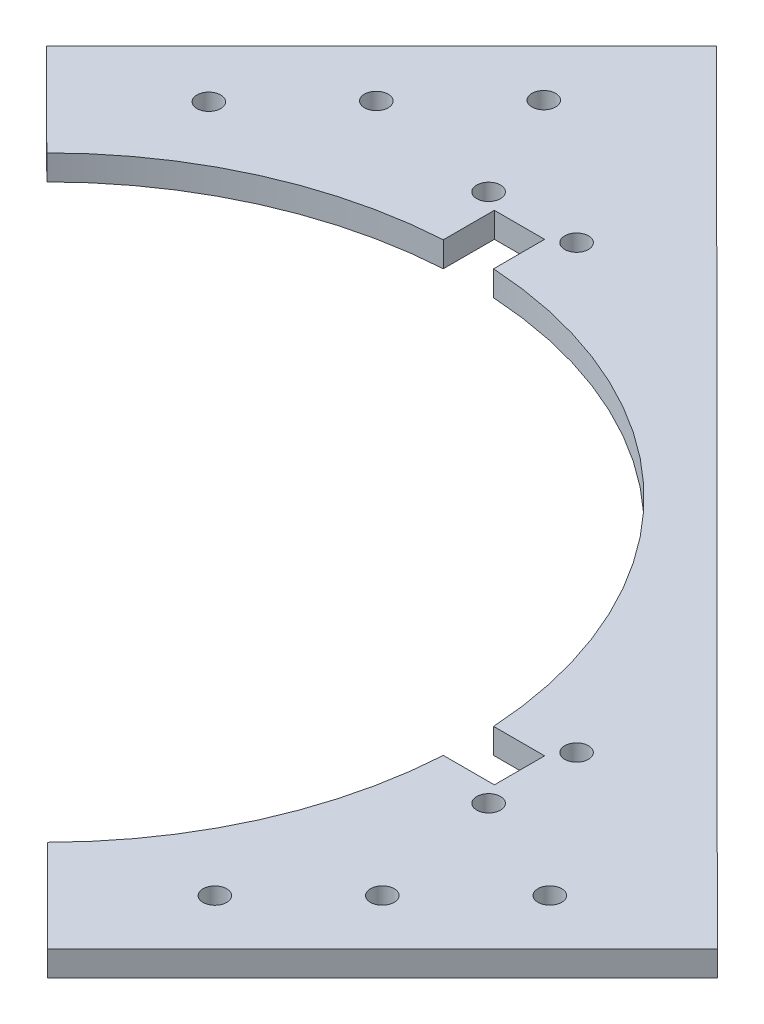
ISO-10303-21;
HEADER;
FILE_DESCRIPTION(('STEP AP214'),'2;1');
FILE_NAME('part.step','',(''),(''),'','','');
FILE_SCHEMA(('AUTOMOTIVE_DESIGN { 1 0 10303 214 1 1 1 1 }'));
ENDSEC;
DATA;
#1=APPLICATION_CONTEXT('core data for automotive mechanical design processes');
#2=APPLICATION_PROTOCOL_DEFINITION('international standard','automotive_design',2000,#1);
#3=PRODUCT_CONTEXT('',#1,'mechanical');
#4=PRODUCT('Part','Part','',(#3));
#5=PRODUCT_RELATED_PRODUCT_CATEGORY('part','',(#4));
#6=PRODUCT_DEFINITION_FORMATION('','',#4);
#7=PRODUCT_DEFINITION_CONTEXT('part definition',#1,'design');
#8=PRODUCT_DEFINITION('design','',#6,#7);
#9=PRODUCT_DEFINITION_SHAPE('','',#8);
#10=(LENGTH_UNIT() NAMED_UNIT(*) SI_UNIT(.MILLI.,.METRE.));
#11=(NAMED_UNIT(*) PLANE_ANGLE_UNIT() SI_UNIT($,.RADIAN.));
#12=(NAMED_UNIT(*) SI_UNIT($,.STERADIAN.) SOLID_ANGLE_UNIT());
#13=UNCERTAINTY_MEASURE_WITH_UNIT(LENGTH_MEASURE(1.E-05),#10,'distance_accuracy_value','');
#14=(GEOMETRIC_REPRESENTATION_CONTEXT(3) GLOBAL_UNCERTAINTY_ASSIGNED_CONTEXT((#13)) GLOBAL_UNIT_ASSIGNED_CONTEXT((#10,
#11,#12)) REPRESENTATION_CONTEXT('',''));
#15=CARTESIAN_POINT('',(0.,0.,0.));
#16=DIRECTION('',(0.,0.,1.));
#17=DIRECTION('',(1.,0.,0.));
#18=AXIS2_PLACEMENT_3D('',#15,#16,#17);
#19=CARTESIAN_POINT('',(0.,3.175,0.));
#20=DIRECTION('',(0.,1.,0.));
#21=DIRECTION('',(0.,0.,1.));
#22=AXIS2_PLACEMENT_3D('',#19,#20,#21);
#23=PLANE('',#22);
#24=CARTESIAN_POINT('',(75.300110897104,3.175,11.7781569073365));
#25=DIRECTION('',(0.,1.,0.));
#26=DIRECTION('',(0.,0.,1.));
#27=AXIS2_PLACEMENT_3D('',#24,#25,#26);
#28=CIRCLE('',#27,1.5);
#29=CARTESIAN_POINT('',(75.300110897104,3.175,13.2781569073365));
#30=VERTEX_POINT('',#29);
#31=EDGE_CURVE('E282',#30,#30,#28,.T.);
#32=ORIENTED_EDGE('',*,*,#31,.F.);
#33=EDGE_LOOP('',(#32));
#34=FACE_BOUND('',#33,.T.);
#35=CARTESIAN_POINT('',(-12.1050839257821,3.175,-74.8656287766845));
#36=DIRECTION('',(0.,-1.,0.));
#37=DIRECTION('',(0.,0.,-1.));
#38=AXIS2_PLACEMENT_3D('',#35,#36,#37);
#39=CIRCLE('',#38,1.5);
#40=CARTESIAN_POINT('',(-12.1050839257821,3.175,-76.3656287766845));
#41=VERTEX_POINT('',#40);
#42=EDGE_CURVE('E273',#41,#41,#39,.T.);
#43=ORIENTED_EDGE('',*,*,#42,.T.);
#44=EDGE_LOOP('',(#43));
#45=FACE_BOUND('',#44,.T.);
#46=CARTESIAN_POINT('',(61.346730494,3.175,5.55625));
#47=DIRECTION('',(0.,1.,0.));
#48=DIRECTION('',(0.,0.,1.));
#49=AXIS2_PLACEMENT_3D('',#46,#47,#48);
#50=CIRCLE('',#49,1.5);
#51=CARTESIAN_POINT('',(61.346730494,3.175,7.05625));
#52=VERTEX_POINT('',#51);
#53=EDGE_CURVE('E181',#52,#52,#50,.T.);
#54=ORIENTED_EDGE('',*,*,#53,.F.);
#55=EDGE_LOOP('',(#54));
#56=FACE_BOUND('',#55,.T.);
#57=CARTESIAN_POINT('',(61.346730494,3.175,-5.55625));
#58=DIRECTION('',(0.,1.,0.));
#59=DIRECTION('',(0.,0.,1.));
#60=AXIS2_PLACEMENT_3D('',#57,#58,#59);
#61=CIRCLE('',#60,1.5);
#62=CARTESIAN_POINT('',(61.346730494,3.175,-4.05625));
#63=VERTEX_POINT('',#62);
#64=EDGE_CURVE('E185',#63,#63,#61,.T.);
#65=ORIENTED_EDGE('',*,*,#64,.F.);
#66=EDGE_LOOP('',(#65));
#67=FACE_BOUND('',#66,.T.);
#68=CARTESIAN_POINT('',(5.55625,3.175,-61.346730494));
#69=DIRECTION('',(0.,1.,0.));
#70=DIRECTION('',(0.,0.,1.));
#71=AXIS2_PLACEMENT_3D('',#68,#69,#70);
#72=CIRCLE('',#71,1.5);
#73=CARTESIAN_POINT('',(5.55625,3.175,-59.846730494));
#74=VERTEX_POINT('',#73);
#75=EDGE_CURVE('E195',#74,#74,#72,.T.);
#76=ORIENTED_EDGE('',*,*,#75,.F.);
#77=EDGE_LOOP('',(#76));
#78=FACE_BOUND('',#77,.T.);
#79=CARTESIAN_POINT('',(-5.55625,3.175,-61.346730494));
#80=DIRECTION('',(0.,1.,0.));
#81=DIRECTION('',(0.,0.,1.));
#82=AXIS2_PLACEMENT_3D('',#79,#80,#81);
#83=CIRCLE('',#82,1.5);
#84=CARTESIAN_POINT('',(-5.55625,3.175,-59.846730494));
#85=VERTEX_POINT('',#84);
#86=EDGE_CURVE('E198',#85,#85,#83,.T.);
#87=ORIENTED_EDGE('',*,*,#86,.F.);
#88=EDGE_LOOP('',(#87));
#89=FACE_BOUND('',#88,.T.);
#90=DIRECTION('',(0.707443172401365,0.,0.706770229864482));
#91=VECTOR('',#90,1.);
#92=CARTESIAN_POINT('',(91.7151038496246,3.175,7.02742668781241));
#93=LINE('',#92,#91);
#94=CARTESIAN_POINT('',(-7.11470733484609,3.175,-91.7083744242558));
#95=VERTEX_POINT('',#94);
#96=CARTESIAN_POINT('',(91.7151038496246,3.175,7.02742668781241));
#97=VERTEX_POINT('',#96);
#98=EDGE_CURVE('E142',#95,#97,#93,.T.);
#99=ORIENTED_EDGE('',*,*,#98,.F.);
#100=DIRECTION('',(0.706770229864482,0.,-0.707443172401365));
#101=VECTOR('',#100,1.);
#102=CARTESIAN_POINT('',(-49.4149055922353,3.175,-49.3679005560341));
#103=LINE('',#102,#101);
#104=CARTESIAN_POINT('',(-49.4149055922353,3.175,-49.3679005560341));
#105=VERTEX_POINT('',#104);
#106=EDGE_CURVE('E151',#105,#95,#103,.T.);
#107=ORIENTED_EDGE('',*,*,#106,.F.);
#108=DIRECTION('',(-0.707443172401365,0.,-0.706770229864482));
#109=VECTOR('',#108,1.);
#110=CARTESIAN_POINT('',(-49.4149055922353,3.175,-49.3679005560341));
#111=LINE('',#110,#109);
#112=CARTESIAN_POINT('',(-37.7350188158888,3.175,-37.6991240609715));
#113=VERTEX_POINT('',#112);
#114=EDGE_CURVE('E257',#113,#105,#111,.T.);
#115=ORIENTED_EDGE('',*,*,#114,.F.);
#116=CARTESIAN_POINT('',(0.,3.175,0.));
#117=DIRECTION('',(0.,1.,0.));
#118=DIRECTION('',(0.,0.,1.));
#119=AXIS2_PLACEMENT_3D('',#116,#117,#118);
#120=CIRCLE('',#119,53.34);
#121=CARTESIAN_POINT('',(-3.175,3.175,-53.2454221036889));
#122=VERTEX_POINT('',#121);
#123=EDGE_CURVE('E194',#122,#113,#120,.T.);
#124=ORIENTED_EDGE('',*,*,#123,.F.);
#125=DIRECTION('',(0.,0.,1.));
#126=VECTOR('',#125,1.);
#127=CARTESIAN_POINT('',(-3.175,3.175,-53.34));
#128=LINE('',#127,#126);
#129=CARTESIAN_POINT('',(-3.175,3.175,-59.69));
#130=VERTEX_POINT('',#129);
#131=EDGE_CURVE('E237',#130,#122,#128,.T.);
#132=ORIENTED_EDGE('',*,*,#131,.F.);
#133=DIRECTION('',(-1.,0.,0.));
#134=VECTOR('',#133,1.);
#135=CARTESIAN_POINT('',(3.175,3.175,-59.69));
#136=LINE('',#135,#134);
#137=CARTESIAN_POINT('',(3.175,3.175,-59.69));
#138=VERTEX_POINT('',#137);
#139=EDGE_CURVE('E240',#138,#130,#136,.T.);
#140=ORIENTED_EDGE('',*,*,#139,.F.);
#141=DIRECTION('',(0.,0.,-1.));
#142=VECTOR('',#141,1.);
#143=CARTESIAN_POINT('',(3.175,3.175,-53.34));
#144=LINE('',#143,#142);
#145=CARTESIAN_POINT('',(3.175,3.175,-53.2454221036889));
#146=VERTEX_POINT('',#145);
#147=EDGE_CURVE('E219',#146,#138,#144,.T.);
#148=ORIENTED_EDGE('',*,*,#147,.F.);
#149=CARTESIAN_POINT('',(53.2454221036889,3.175,-3.17499999999981));
#150=VERTEX_POINT('',#149);
#151=EDGE_CURVE('E193',#150,#146,#120,.T.);
#152=ORIENTED_EDGE('',*,*,#151,.F.);
#153=DIRECTION('',(-1.,0.,0.));
#154=VECTOR('',#153,1.);
#155=CARTESIAN_POINT('',(53.3400000000014,3.175,-3.17499999999981));
#156=LINE('',#155,#154);
#157=CARTESIAN_POINT('',(59.6900000000014,3.175,-3.17499999999981));
#158=VERTEX_POINT('',#157);
#159=EDGE_CURVE('E220',#158,#150,#156,.T.);
#160=ORIENTED_EDGE('',*,*,#159,.F.);
#161=DIRECTION('',(0.,0.,-1.));
#162=VECTOR('',#161,1.);
#163=CARTESIAN_POINT('',(59.6900000000014,3.175,3.17500000000019));
#164=LINE('',#163,#162);
#165=CARTESIAN_POINT('',(59.6900000000014,3.175,3.17500000000019));
#166=VERTEX_POINT('',#165);
#167=EDGE_CURVE('E223',#166,#158,#164,.T.);
#168=ORIENTED_EDGE('',*,*,#167,.F.);
#169=DIRECTION('',(1.,0.,0.));
#170=VECTOR('',#169,1.);
#171=CARTESIAN_POINT('',(53.3400000000014,3.175,3.17500000000019));
#172=LINE('',#171,#170);
#173=CARTESIAN_POINT('',(53.2454221036889,3.175,3.17500000000019));
#174=VERTEX_POINT('',#173);
#175=EDGE_CURVE('E226',#174,#166,#172,.T.);
#176=ORIENTED_EDGE('',*,*,#175,.F.);
#177=CARTESIAN_POINT('',(37.7350188158888,3.175,37.6991240609715));
#178=VERTEX_POINT('',#177);
#179=EDGE_CURVE('E189',#178,#174,#120,.T.);
#180=ORIENTED_EDGE('',*,*,#179,.F.);
#181=CARTESIAN_POINT('',(49.4149055922354,3.175,49.3679005560341));
#182=VERTEX_POINT('',#181);
#183=EDGE_CURVE('E255',#182,#178,#111,.T.);
#184=ORIENTED_EDGE('',*,*,#183,.F.);
#185=DIRECTION('',(0.706770229864482,0.,-0.707443172401365));
#186=VECTOR('',#185,1.);
#187=CARTESIAN_POINT('',(49.4149055922353,3.175,49.3679005560341));
#188=LINE('',#187,#186);
#189=EDGE_CURVE('E179',#182,#97,#188,.T.);
#190=ORIENTED_EDGE('',*,*,#189,.T.);
#191=EDGE_LOOP('',(#99,#107,#115,#124,#132,#140,#148,#152,#160,#168,#176,#180,#184,#190));
#192=FACE_BOUND('',#191,.T.);
#193=CARTESIAN_POINT('',(54.1500117684094,3.175,32.9483938414474));
#194=DIRECTION('',(0.,1.,0.));
#195=DIRECTION('',(0.,0.,1.));
#196=AXIS2_PLACEMENT_3D('',#193,#194,#195);
#197=CIRCLE('',#196,1.5);
#198=CARTESIAN_POINT('',(54.1500117684094,3.175,34.4483938414474));
#199=VERTEX_POINT('',#198);
#200=EDGE_CURVE('E265',#199,#199,#197,.T.);
#201=ORIENTED_EDGE('',*,*,#200,.F.);
#202=EDGE_LOOP('',(#201));
#203=FACE_BOUND('',#202,.T.);
#204=CARTESIAN_POINT('',(64.7250613327567,3.175,22.3632753743919));
#205=DIRECTION('',(0.,1.,0.));
#206=DIRECTION('',(0.,0.,1.));
#207=AXIS2_PLACEMENT_3D('',#204,#205,#206);
#208=CIRCLE('',#207,1.5);
#209=CARTESIAN_POINT('',(64.7250613327567,3.175,23.8632753743919));
#210=VERTEX_POINT('',#209);
#211=EDGE_CURVE('E279',#210,#210,#208,.T.);
#212=ORIENTED_EDGE('',*,*,#211,.F.);
#213=EDGE_LOOP('',(#212));
#214=FACE_BOUND('',#213,.T.);
#215=CARTESIAN_POINT('',(-22.5972740365531,3.175,-64.1983726660701));
#216=DIRECTION('',(0.,-1.,0.));
#217=DIRECTION('',(0.,0.,-1.));
#218=AXIS2_PLACEMENT_3D('',#215,#216,#217);
#219=CIRCLE('',#218,1.5);
#220=CARTESIAN_POINT('',(-22.5972740365531,3.175,-65.6983726660701));
#221=VERTEX_POINT('',#220);
#222=EDGE_CURVE('E272',#221,#221,#219,.T.);
#223=ORIENTED_EDGE('',*,*,#222,.T.);
#224=EDGE_LOOP('',(#223));
#225=FACE_BOUND('',#224,.T.);
#226=CARTESIAN_POINT('',(-33.0894641473241,3.175,-53.5311165554559));
#227=DIRECTION('',(0.,-1.,0.));
#228=DIRECTION('',(0.,0.,-1.));
#229=AXIS2_PLACEMENT_3D('',#226,#227,#228);
#230=CIRCLE('',#229,1.50000000000001);
#231=CARTESIAN_POINT('',(-33.0894641473241,3.175,-55.0311165554559));
#232=VERTEX_POINT('',#231);
#233=EDGE_CURVE('E285',#232,#232,#230,.T.);
#234=ORIENTED_EDGE('',*,*,#233,.T.);
#235=EDGE_LOOP('',(#234));
#236=FACE_BOUND('',#235,.T.);
#237=ADVANCED_FACE('F35',(#34,#45,#56,#67,#78,#89,#192,#203,#214,#225,#236),#23,.T.);
#238=CARTESIAN_POINT('',(0.,0.,0.));
#239=DIRECTION('',(0.,1.,0.));
#240=DIRECTION('',(0.,0.,1.));
#241=AXIS2_PLACEMENT_3D('',#238,#239,#240);
#242=PLANE('',#241);
#243=CARTESIAN_POINT('',(75.300110897104,0.,11.7781569073365));
#244=DIRECTION('',(0.,1.,0.));
#245=DIRECTION('',(0.,0.,1.));
#246=AXIS2_PLACEMENT_3D('',#243,#244,#245);
#247=CIRCLE('',#246,1.5);
#248=CARTESIAN_POINT('',(75.300110897104,0.,13.2781569073365));
#249=VERTEX_POINT('',#248);
#250=EDGE_CURVE('E260',#249,#249,#247,.T.);
#251=ORIENTED_EDGE('',*,*,#250,.T.);
#252=EDGE_LOOP('',(#251));
#253=FACE_BOUND('',#252,.T.);
#254=CARTESIAN_POINT('',(64.7250613327567,0.,22.3632753743919));
#255=DIRECTION('',(0.,1.,0.));
#256=DIRECTION('',(0.,0.,1.));
#257=AXIS2_PLACEMENT_3D('',#254,#255,#256);
#258=CIRCLE('',#257,1.5);
#259=CARTESIAN_POINT('',(64.7250613327567,0.,23.8632753743919));
#260=VERTEX_POINT('',#259);
#261=EDGE_CURVE('E276',#260,#260,#258,.T.);
#262=ORIENTED_EDGE('',*,*,#261,.T.);
#263=EDGE_LOOP('',(#262));
#264=FACE_BOUND('',#263,.T.);
#265=CARTESIAN_POINT('',(54.1500117684094,0.,32.9483938414474));
#266=DIRECTION('',(0.,1.,0.));
#267=DIRECTION('',(0.,0.,1.));
#268=AXIS2_PLACEMENT_3D('',#265,#266,#267);
#269=CIRCLE('',#268,1.5);
#270=CARTESIAN_POINT('',(54.1500117684094,0.,34.4483938414474));
#271=VERTEX_POINT('',#270);
#272=EDGE_CURVE('E262',#271,#271,#269,.T.);
#273=ORIENTED_EDGE('',*,*,#272,.T.);
#274=EDGE_LOOP('',(#273));
#275=FACE_BOUND('',#274,.T.);
#276=CARTESIAN_POINT('',(-5.55625,0.,-61.346730494));
#277=DIRECTION('',(0.,1.,0.));
#278=DIRECTION('',(0.,0.,1.));
#279=AXIS2_PLACEMENT_3D('',#276,#277,#278);
#280=CIRCLE('',#279,1.5);
#281=CARTESIAN_POINT('',(-5.55625,0.,-59.846730494));
#282=VERTEX_POINT('',#281);
#283=EDGE_CURVE('E158',#282,#282,#280,.T.);
#284=ORIENTED_EDGE('',*,*,#283,.T.);
#285=EDGE_LOOP('',(#284));
#286=FACE_BOUND('',#285,.T.);
#287=CARTESIAN_POINT('',(5.55625,0.,-61.346730494));
#288=DIRECTION('',(0.,1.,0.));
#289=DIRECTION('',(0.,0.,1.));
#290=AXIS2_PLACEMENT_3D('',#287,#288,#289);
#291=CIRCLE('',#290,1.5);
#292=CARTESIAN_POINT('',(5.55625,0.,-59.846730494));
#293=VERTEX_POINT('',#292);
#294=EDGE_CURVE('E162',#293,#293,#291,.T.);
#295=ORIENTED_EDGE('',*,*,#294,.T.);
#296=EDGE_LOOP('',(#295));
#297=FACE_BOUND('',#296,.T.);
#298=DIRECTION('',(0.706770229864482,0.,-0.707443172401365));
#299=VECTOR('',#298,1.);
#300=CARTESIAN_POINT('',(-49.4149055922353,0.,-49.3679005560341));
#301=LINE('',#300,#299);
#302=CARTESIAN_POINT('',(-49.4149055922353,0.,-49.3679005560341));
#303=VERTEX_POINT('',#302);
#304=CARTESIAN_POINT('',(-7.11470733484609,0.,-91.7083744242558));
#305=VERTEX_POINT('',#304);
#306=EDGE_CURVE('E149',#303,#305,#301,.T.);
#307=ORIENTED_EDGE('',*,*,#306,.T.);
#308=DIRECTION('',(0.707443172401365,0.,0.706770229864482));
#309=VECTOR('',#308,1.);
#310=CARTESIAN_POINT('',(91.7151038496246,0.,7.02742668781241));
#311=LINE('',#310,#309);
#312=CARTESIAN_POINT('',(91.7151038496246,0.,7.0274266878124));
#313=VERTEX_POINT('',#312);
#314=EDGE_CURVE('E133',#305,#313,#311,.T.);
#315=ORIENTED_EDGE('',*,*,#314,.T.);
#316=DIRECTION('',(0.706770229864482,0.,-0.707443172401365));
#317=VECTOR('',#316,1.);
#318=CARTESIAN_POINT('',(49.4149055922353,0.,49.3679005560341));
#319=LINE('',#318,#317);
#320=CARTESIAN_POINT('',(49.4149055922354,0.,49.3679005560341));
#321=VERTEX_POINT('',#320);
#322=EDGE_CURVE('E159',#321,#313,#319,.T.);
#323=ORIENTED_EDGE('',*,*,#322,.F.);
#324=DIRECTION('',(-0.707443172401365,0.,-0.706770229864482));
#325=VECTOR('',#324,1.);
#326=CARTESIAN_POINT('',(-49.4149055922353,0.,-49.3679005560341));
#327=LINE('',#326,#325);
#328=CARTESIAN_POINT('',(37.7350188158888,0.,37.6991240609715));
#329=VERTEX_POINT('',#328);
#330=EDGE_CURVE('E253',#321,#329,#327,.T.);
#331=ORIENTED_EDGE('',*,*,#330,.T.);
#332=CARTESIAN_POINT('',(0.,0.,0.));
#333=DIRECTION('',(0.,1.,0.));
#334=DIRECTION('',(0.,0.,1.));
#335=AXIS2_PLACEMENT_3D('',#332,#333,#334);
#336=CIRCLE('',#335,53.34);
#337=CARTESIAN_POINT('',(53.2454221036889,0.,3.17500000000019));
#338=VERTEX_POINT('',#337);
#339=EDGE_CURVE('E171',#329,#338,#336,.T.);
#340=ORIENTED_EDGE('',*,*,#339,.T.);
#341=DIRECTION('',(1.,0.,0.));
#342=VECTOR('',#341,1.);
#343=CARTESIAN_POINT('',(0.,0.,3.17500000000019));
#344=LINE('',#343,#342);
#345=CARTESIAN_POINT('',(59.6900000000014,0.,3.17500000000019));
#346=VERTEX_POINT('',#345);
#347=EDGE_CURVE('E43',#338,#346,#344,.T.);
#348=ORIENTED_EDGE('',*,*,#347,.T.);
#349=DIRECTION('',(0.,0.,-1.));
#350=VECTOR('',#349,1.);
#351=CARTESIAN_POINT('',(59.6900000000014,0.,3.17500000000019));
#352=LINE('',#351,#350);
#353=CARTESIAN_POINT('',(59.6900000000014,0.,-3.17499999999981));
#354=VERTEX_POINT('',#353);
#355=EDGE_CURVE('E222',#346,#354,#352,.T.);
#356=ORIENTED_EDGE('',*,*,#355,.T.);
#357=DIRECTION('',(-1.,0.,0.));
#358=VECTOR('',#357,1.);
#359=CARTESIAN_POINT('',(59.6900000000014,0.,-3.17499999999981));
#360=LINE('',#359,#358);
#361=CARTESIAN_POINT('',(53.2454221036889,0.,-3.17499999999981));
#362=VERTEX_POINT('',#361);
#363=EDGE_CURVE('E217',#354,#362,#360,.T.);
#364=ORIENTED_EDGE('',*,*,#363,.T.);
#365=CARTESIAN_POINT('',(3.175,0.,-53.2454221036889));
#366=VERTEX_POINT('',#365);
#367=EDGE_CURVE('E174',#362,#366,#336,.T.);
#368=ORIENTED_EDGE('',*,*,#367,.T.);
#369=DIRECTION('',(0.,0.,-1.));
#370=VECTOR('',#369,1.);
#371=CARTESIAN_POINT('',(3.175,0.,0.));
#372=LINE('',#371,#370);
#373=CARTESIAN_POINT('',(3.175,0.,-59.69));
#374=VERTEX_POINT('',#373);
#375=EDGE_CURVE('E11',#366,#374,#372,.T.);
#376=ORIENTED_EDGE('',*,*,#375,.T.);
#377=DIRECTION('',(-1.,0.,0.));
#378=VECTOR('',#377,1.);
#379=CARTESIAN_POINT('',(3.175,0.,-59.69));
#380=LINE('',#379,#378);
#381=CARTESIAN_POINT('',(-3.175,0.,-59.69));
#382=VERTEX_POINT('',#381);
#383=EDGE_CURVE('E239',#374,#382,#380,.T.);
#384=ORIENTED_EDGE('',*,*,#383,.T.);
#385=DIRECTION('',(0.,0.,1.));
#386=VECTOR('',#385,1.);
#387=CARTESIAN_POINT('',(-3.175,0.,-59.69));
#388=LINE('',#387,#386);
#389=CARTESIAN_POINT('',(-3.175,0.,-53.2454221036889));
#390=VERTEX_POINT('',#389);
#391=EDGE_CURVE('E235',#382,#390,#388,.T.);
#392=ORIENTED_EDGE('',*,*,#391,.T.);
#393=CARTESIAN_POINT('',(-37.7350188158888,0.,-37.6991240609715));
#394=VERTEX_POINT('',#393);
#395=EDGE_CURVE('E170',#390,#394,#336,.T.);
#396=ORIENTED_EDGE('',*,*,#395,.T.);
#397=EDGE_CURVE('E157',#394,#303,#327,.T.);
#398=ORIENTED_EDGE('',*,*,#397,.T.);
#399=EDGE_LOOP('',(#307,#315,#323,#331,#340,#348,#356,#364,#368,#376,#384,#392,#396,#398));
#400=FACE_BOUND('',#399,.T.);
#401=CARTESIAN_POINT('',(61.346730494,0.,-5.55625));
#402=DIRECTION('',(0.,1.,0.));
#403=DIRECTION('',(0.,0.,1.));
#404=AXIS2_PLACEMENT_3D('',#401,#402,#403);
#405=CIRCLE('',#404,1.5);
#406=CARTESIAN_POINT('',(61.346730494,0.,-4.05625));
#407=VERTEX_POINT('',#406);
#408=EDGE_CURVE('E173',#407,#407,#405,.T.);
#409=ORIENTED_EDGE('',*,*,#408,.T.);
#410=EDGE_LOOP('',(#409));
#411=FACE_BOUND('',#410,.T.);
#412=CARTESIAN_POINT('',(61.346730494,0.,5.55625));
#413=DIRECTION('',(0.,1.,0.));
#414=DIRECTION('',(0.,0.,1.));
#415=AXIS2_PLACEMENT_3D('',#412,#413,#414);
#416=CIRCLE('',#415,1.5);
#417=CARTESIAN_POINT('',(61.346730494,0.,7.05625));
#418=VERTEX_POINT('',#417);
#419=EDGE_CURVE('E177',#418,#418,#416,.T.);
#420=ORIENTED_EDGE('',*,*,#419,.T.);
#421=EDGE_LOOP('',(#420));
#422=FACE_BOUND('',#421,.T.);
#423=CARTESIAN_POINT('',(-22.5972740365531,0.,-64.1983726660701));
#424=DIRECTION('',(0.,-1.,0.));
#425=DIRECTION('',(0.,0.,-1.));
#426=AXIS2_PLACEMENT_3D('',#423,#424,#425);
#427=CIRCLE('',#426,1.5);
#428=CARTESIAN_POINT('',(-22.5972740365531,0.,-65.6983726660701));
#429=VERTEX_POINT('',#428);
#430=EDGE_CURVE('E269',#429,#429,#427,.T.);
#431=ORIENTED_EDGE('',*,*,#430,.F.);
#432=EDGE_LOOP('',(#431));
#433=FACE_BOUND('',#432,.T.);
#434=CARTESIAN_POINT('',(-12.1050839257821,0.,-74.8656287766845));
#435=DIRECTION('',(0.,-1.,0.));
#436=DIRECTION('',(0.,0.,-1.));
#437=AXIS2_PLACEMENT_3D('',#434,#435,#436);
#438=CIRCLE('',#437,1.5);
#439=CARTESIAN_POINT('',(-12.1050839257821,0.,-76.3656287766845));
#440=VERTEX_POINT('',#439);
#441=EDGE_CURVE('E288',#440,#440,#438,.T.);
#442=ORIENTED_EDGE('',*,*,#441,.F.);
#443=EDGE_LOOP('',(#442));
#444=FACE_BOUND('',#443,.T.);
#445=CARTESIAN_POINT('',(-33.0894641473241,0.,-53.5311165554559));
#446=DIRECTION('',(0.,-1.,0.));
#447=DIRECTION('',(0.,0.,-1.));
#448=AXIS2_PLACEMENT_3D('',#445,#446,#447);
#449=CIRCLE('',#448,1.50000000000001);
#450=CARTESIAN_POINT('',(-33.0894641473241,0.,-55.0311165554559));
#451=VERTEX_POINT('',#450);
#452=EDGE_CURVE('E268',#451,#451,#449,.T.);
#453=ORIENTED_EDGE('',*,*,#452,.F.);
#454=EDGE_LOOP('',(#453));
#455=FACE_BOUND('',#454,.T.);
#456=ADVANCED_FACE('F154',(#253,#264,#275,#286,#297,#400,#411,#422,#433,#444,#455),#242,.F.);
#457=CARTESIAN_POINT('',(0.,3.175,0.));
#458=DIRECTION('',(0.,-1.,0.));
#459=DIRECTION('',(0.,0.,-1.));
#460=AXIS2_PLACEMENT_3D('',#457,#458,#459);
#461=CYLINDRICAL_SURFACE('',#460,53.34);
#462=DIRECTION('',(0.,-1.,0.));
#463=VECTOR('',#462,1.);
#464=CARTESIAN_POINT('',(-37.7350188158888,3.175,-37.6991240609715));
#465=LINE('',#464,#463);
#466=EDGE_CURVE('E228',#394,#113,#465,.F.);
#467=ORIENTED_EDGE('',*,*,#466,.F.);
#468=ORIENTED_EDGE('',*,*,#395,.F.);
#469=DIRECTION('',(0.,-1.,0.));
#470=VECTOR('',#469,1.);
#471=CARTESIAN_POINT('',(-3.175,3.175,-53.2454221036889));
#472=LINE('',#471,#470);
#473=EDGE_CURVE('E164',#122,#390,#472,.T.);
#474=ORIENTED_EDGE('',*,*,#473,.F.);
#475=ORIENTED_EDGE('',*,*,#123,.T.);
#476=EDGE_LOOP('',(#467,#468,#474,#475));
#477=FACE_BOUND('',#476,.T.);
#478=ADVANCED_FACE('F382',(#477),#461,.F.);
#479=DIRECTION('',(0.,-1.,0.));
#480=VECTOR('',#479,1.);
#481=CARTESIAN_POINT('',(3.175,3.175,-53.2454221036889));
#482=LINE('',#481,#480);
#483=EDGE_CURVE('E205',#366,#146,#482,.F.);
#484=ORIENTED_EDGE('',*,*,#483,.F.);
#485=ORIENTED_EDGE('',*,*,#367,.F.);
#486=DIRECTION('',(0.,-1.,0.));
#487=VECTOR('',#486,1.);
#488=CARTESIAN_POINT('',(53.2454221036889,3.175,-3.17499999999981));
#489=LINE('',#488,#487);
#490=EDGE_CURVE('E207',#150,#362,#489,.T.);
#491=ORIENTED_EDGE('',*,*,#490,.F.);
#492=ORIENTED_EDGE('',*,*,#151,.T.);
#493=EDGE_LOOP('',(#484,#485,#491,#492));
#494=FACE_BOUND('',#493,.T.);
#495=ADVANCED_FACE('F393',(#494),#461,.F.);
#496=DIRECTION('',(0.,-1.,0.));
#497=VECTOR('',#496,1.);
#498=CARTESIAN_POINT('',(37.7350188158888,3.175,37.6991240609715));
#499=LINE('',#498,#497);
#500=EDGE_CURVE('E58',#178,#329,#499,.T.);
#501=ORIENTED_EDGE('',*,*,#500,.F.);
#502=ORIENTED_EDGE('',*,*,#179,.T.);
#503=DIRECTION('',(0.,-1.,0.));
#504=VECTOR('',#503,1.);
#505=CARTESIAN_POINT('',(53.2454221036889,3.175,3.17500000000019));
#506=LINE('',#505,#504);
#507=EDGE_CURVE('E209',#338,#174,#506,.F.);
#508=ORIENTED_EDGE('',*,*,#507,.F.);
#509=ORIENTED_EDGE('',*,*,#339,.F.);
#510=EDGE_LOOP('',(#501,#502,#508,#509));
#511=FACE_BOUND('',#510,.T.);
#512=ADVANCED_FACE('F395',(#511),#461,.F.);
#513=CARTESIAN_POINT('',(49.4149055922353,3.175,49.3679005560341));
#514=DIRECTION('',(-0.707443172401365,0.,-0.706770229864482));
#515=DIRECTION('',(-0.706770229864482,0.,0.707443172401365));
#516=AXIS2_PLACEMENT_3D('',#513,#514,#515);
#517=PLANE('',#516);
#518=ORIENTED_EDGE('',*,*,#322,.T.);
#519=DIRECTION('',(0.,1.,0.));
#520=VECTOR('',#519,1.);
#521=CARTESIAN_POINT('',(91.7151038496246,0.,7.02742668781241));
#522=LINE('',#521,#520);
#523=EDGE_CURVE('E50',#313,#97,#522,.T.);
#524=ORIENTED_EDGE('',*,*,#523,.T.);
#525=ORIENTED_EDGE('',*,*,#189,.F.);
#526=DIRECTION('',(0.,1.,0.));
#527=VECTOR('',#526,1.);
#528=CARTESIAN_POINT('',(49.4149055922354,0.,49.3679005560341));
#529=LINE('',#528,#527);
#530=EDGE_CURVE('E251',#321,#182,#529,.T.);
#531=ORIENTED_EDGE('',*,*,#530,.F.);
#532=EDGE_LOOP('',(#518,#524,#525,#531));
#533=FACE_BOUND('',#532,.T.);
#534=ADVANCED_FACE('F37',(#533),#517,.F.);
#535=CARTESIAN_POINT('',(61.346730494,3.175,5.55625));
#536=DIRECTION('',(0.,-1.,0.));
#537=DIRECTION('',(0.,0.,-1.));
#538=AXIS2_PLACEMENT_3D('',#535,#536,#537);
#539=CYLINDRICAL_SURFACE('',#538,1.5);
#540=ORIENTED_EDGE('',*,*,#53,.T.);
#541=EDGE_LOOP('',(#540));
#542=FACE_BOUND('',#541,.T.);
#543=ORIENTED_EDGE('',*,*,#419,.F.);
#544=EDGE_LOOP('',(#543));
#545=FACE_BOUND('',#544,.T.);
#546=ADVANCED_FACE('F383',(#542,#545),#539,.F.);
#547=CARTESIAN_POINT('',(61.346730494,3.175,-5.55625));
#548=DIRECTION('',(0.,-1.,0.));
#549=DIRECTION('',(0.,0.,-1.));
#550=AXIS2_PLACEMENT_3D('',#547,#548,#549);
#551=CYLINDRICAL_SURFACE('',#550,1.5);
#552=ORIENTED_EDGE('',*,*,#64,.T.);
#553=EDGE_LOOP('',(#552));
#554=FACE_BOUND('',#553,.T.);
#555=ORIENTED_EDGE('',*,*,#408,.F.);
#556=EDGE_LOOP('',(#555));
#557=FACE_BOUND('',#556,.T.);
#558=ADVANCED_FACE('F386',(#554,#557),#551,.F.);
#559=CARTESIAN_POINT('',(5.55625,3.175,-61.346730494));
#560=DIRECTION('',(0.,-1.,0.));
#561=DIRECTION('',(0.,0.,-1.));
#562=AXIS2_PLACEMENT_3D('',#559,#560,#561);
#563=CYLINDRICAL_SURFACE('',#562,1.5);
#564=ORIENTED_EDGE('',*,*,#75,.T.);
#565=EDGE_LOOP('',(#564));
#566=FACE_BOUND('',#565,.T.);
#567=ORIENTED_EDGE('',*,*,#294,.F.);
#568=EDGE_LOOP('',(#567));
#569=FACE_BOUND('',#568,.T.);
#570=ADVANCED_FACE('F389',(#566,#569),#563,.F.);
#571=CARTESIAN_POINT('',(-5.55625,3.175,-61.346730494));
#572=DIRECTION('',(0.,-1.,0.));
#573=DIRECTION('',(0.,0.,-1.));
#574=AXIS2_PLACEMENT_3D('',#571,#572,#573);
#575=CYLINDRICAL_SURFACE('',#574,1.5);
#576=ORIENTED_EDGE('',*,*,#86,.T.);
#577=EDGE_LOOP('',(#576));
#578=FACE_BOUND('',#577,.T.);
#579=ORIENTED_EDGE('',*,*,#283,.F.);
#580=EDGE_LOOP('',(#579));
#581=FACE_BOUND('',#580,.T.);
#582=ADVANCED_FACE('F398',(#578,#581),#575,.F.);
#583=CARTESIAN_POINT('',(-49.4149055922353,3.175,-49.3679005560341));
#584=DIRECTION('',(-0.707443172401365,0.,-0.706770229864482));
#585=DIRECTION('',(-0.706770229864482,0.,0.707443172401365));
#586=AXIS2_PLACEMENT_3D('',#583,#584,#585);
#587=PLANE('',#586);
#588=DIRECTION('',(0.,1.,0.));
#589=VECTOR('',#588,1.);
#590=CARTESIAN_POINT('',(-7.11470733484609,0.,-91.7083744242558));
#591=LINE('',#590,#589);
#592=EDGE_CURVE('E136',#305,#95,#591,.T.);
#593=ORIENTED_EDGE('',*,*,#592,.F.);
#594=ORIENTED_EDGE('',*,*,#306,.F.);
#595=DIRECTION('',(0.,1.,0.));
#596=VECTOR('',#595,1.);
#597=CARTESIAN_POINT('',(-49.4149055922353,0.,-49.3679005560341));
#598=LINE('',#597,#596);
#599=EDGE_CURVE('E250',#303,#105,#598,.T.);
#600=ORIENTED_EDGE('',*,*,#599,.T.);
#601=ORIENTED_EDGE('',*,*,#106,.T.);
#602=EDGE_LOOP('',(#593,#594,#600,#601));
#603=FACE_BOUND('',#602,.T.);
#604=ADVANCED_FACE('F147',(#603),#587,.T.);
#605=CARTESIAN_POINT('',(53.3400000000014,0.,-3.17499999999981));
#606=DIRECTION('',(0.,0.,-1.));
#607=DIRECTION('',(-1.,0.,0.));
#608=AXIS2_PLACEMENT_3D('',#605,#606,#607);
#609=PLANE('',#608);
#610=ORIENTED_EDGE('',*,*,#490,.T.);
#611=ORIENTED_EDGE('',*,*,#363,.F.);
#612=DIRECTION('',(0.,1.,0.));
#613=VECTOR('',#612,1.);
#614=CARTESIAN_POINT('',(59.6900000000014,0.,-3.17499999999981));
#615=LINE('',#614,#613);
#616=EDGE_CURVE('E216',#354,#158,#615,.T.);
#617=ORIENTED_EDGE('',*,*,#616,.T.);
#618=ORIENTED_EDGE('',*,*,#159,.T.);
#619=EDGE_LOOP('',(#610,#611,#617,#618));
#620=FACE_BOUND('',#619,.T.);
#621=ADVANCED_FACE('F369',(#620),#609,.F.);
#622=CARTESIAN_POINT('',(59.6900000000014,0.,3.17500000000019));
#623=DIRECTION('',(1.,0.,0.));
#624=DIRECTION('',(0.,0.,-1.));
#625=AXIS2_PLACEMENT_3D('',#622,#623,#624);
#626=PLANE('',#625);
#627=ORIENTED_EDGE('',*,*,#167,.T.);
#628=ORIENTED_EDGE('',*,*,#616,.F.);
#629=ORIENTED_EDGE('',*,*,#355,.F.);
#630=DIRECTION('',(0.,1.,0.));
#631=VECTOR('',#630,1.);
#632=CARTESIAN_POINT('',(59.6900000000014,0.,3.17500000000019));
#633=LINE('',#632,#631);
#634=EDGE_CURVE('E213',#346,#166,#633,.T.);
#635=ORIENTED_EDGE('',*,*,#634,.T.);
#636=EDGE_LOOP('',(#627,#628,#629,#635));
#637=FACE_BOUND('',#636,.T.);
#638=ADVANCED_FACE('F372',(#637),#626,.F.);
#639=CARTESIAN_POINT('',(53.3400000000014,0.,3.17500000000019));
#640=DIRECTION('',(0.,0.,1.));
#641=DIRECTION('',(1.,0.,0.));
#642=AXIS2_PLACEMENT_3D('',#639,#640,#641);
#643=PLANE('',#642);
#644=ORIENTED_EDGE('',*,*,#507,.T.);
#645=ORIENTED_EDGE('',*,*,#175,.T.);
#646=ORIENTED_EDGE('',*,*,#634,.F.);
#647=ORIENTED_EDGE('',*,*,#347,.F.);
#648=EDGE_LOOP('',(#644,#645,#646,#647));
#649=FACE_BOUND('',#648,.T.);
#650=ADVANCED_FACE('F360',(#649),#643,.F.);
#651=CARTESIAN_POINT('',(-3.175,0.,-53.34));
#652=DIRECTION('',(-1.,0.,0.));
#653=DIRECTION('',(0.,0.,1.));
#654=AXIS2_PLACEMENT_3D('',#651,#652,#653);
#655=PLANE('',#654);
#656=ORIENTED_EDGE('',*,*,#473,.T.);
#657=ORIENTED_EDGE('',*,*,#391,.F.);
#658=DIRECTION('',(0.,1.,0.));
#659=VECTOR('',#658,1.);
#660=CARTESIAN_POINT('',(-3.175,0.,-59.69));
#661=LINE('',#660,#659);
#662=EDGE_CURVE('E212',#382,#130,#661,.T.);
#663=ORIENTED_EDGE('',*,*,#662,.T.);
#664=ORIENTED_EDGE('',*,*,#131,.T.);
#665=EDGE_LOOP('',(#656,#657,#663,#664));
#666=FACE_BOUND('',#665,.T.);
#667=ADVANCED_FACE('F356',(#666),#655,.F.);
#668=CARTESIAN_POINT('',(3.175,0.,-59.69));
#669=DIRECTION('',(0.,0.,-1.));
#670=DIRECTION('',(-1.,0.,0.));
#671=AXIS2_PLACEMENT_3D('',#668,#669,#670);
#672=PLANE('',#671);
#673=ORIENTED_EDGE('',*,*,#139,.T.);
#674=ORIENTED_EDGE('',*,*,#662,.F.);
#675=ORIENTED_EDGE('',*,*,#383,.F.);
#676=DIRECTION('',(0.,1.,0.));
#677=VECTOR('',#676,1.);
#678=CARTESIAN_POINT('',(3.175,0.,-59.69));
#679=LINE('',#678,#677);
#680=EDGE_CURVE('E232',#374,#138,#679,.T.);
#681=ORIENTED_EDGE('',*,*,#680,.T.);
#682=EDGE_LOOP('',(#673,#674,#675,#681));
#683=FACE_BOUND('',#682,.T.);
#684=ADVANCED_FACE('F359',(#683),#672,.F.);
#685=CARTESIAN_POINT('',(3.175,0.,-53.34));
#686=DIRECTION('',(1.,0.,0.));
#687=DIRECTION('',(0.,0.,-1.));
#688=AXIS2_PLACEMENT_3D('',#685,#686,#687);
#689=PLANE('',#688);
#690=ORIENTED_EDGE('',*,*,#483,.T.);
#691=ORIENTED_EDGE('',*,*,#147,.T.);
#692=ORIENTED_EDGE('',*,*,#680,.F.);
#693=ORIENTED_EDGE('',*,*,#375,.F.);
#694=EDGE_LOOP('',(#690,#691,#692,#693));
#695=FACE_BOUND('',#694,.T.);
#696=ADVANCED_FACE('F364',(#695),#689,.F.);
#697=CARTESIAN_POINT('',(-49.4149055922353,0.,-49.3679005560341));
#698=DIRECTION('',(0.706770229864482,0.,-0.707443172401365));
#699=DIRECTION('',(-0.707443172401365,0.,-0.706770229864482));
#700=AXIS2_PLACEMENT_3D('',#697,#698,#699);
#701=PLANE('',#700);
#702=ORIENTED_EDGE('',*,*,#466,.T.);
#703=ORIENTED_EDGE('',*,*,#114,.T.);
#704=ORIENTED_EDGE('',*,*,#599,.F.);
#705=ORIENTED_EDGE('',*,*,#397,.F.);
#706=EDGE_LOOP('',(#702,#703,#704,#705));
#707=FACE_BOUND('',#706,.T.);
#708=ADVANCED_FACE('F355',(#707),#701,.F.);
#709=ORIENTED_EDGE('',*,*,#500,.T.);
#710=ORIENTED_EDGE('',*,*,#330,.F.);
#711=ORIENTED_EDGE('',*,*,#530,.T.);
#712=ORIENTED_EDGE('',*,*,#183,.T.);
#713=EDGE_LOOP('',(#709,#710,#711,#712));
#714=FACE_BOUND('',#713,.T.);
#715=ADVANCED_FACE('F352',(#714),#701,.F.);
#716=CARTESIAN_POINT('',(91.7151038496246,0.,7.02742668781241));
#717=DIRECTION('',(-0.706770229864482,0.,0.707443172401365));
#718=DIRECTION('',(0.707443172401365,0.,0.706770229864482));
#719=AXIS2_PLACEMENT_3D('',#716,#717,#718);
#720=PLANE('',#719);
#721=ORIENTED_EDGE('',*,*,#98,.T.);
#722=ORIENTED_EDGE('',*,*,#523,.F.);
#723=ORIENTED_EDGE('',*,*,#314,.F.);
#724=ORIENTED_EDGE('',*,*,#592,.T.);
#725=EDGE_LOOP('',(#721,#722,#723,#724));
#726=FACE_BOUND('',#725,.T.);
#727=ADVANCED_FACE('F135',(#726),#720,.F.);
#728=CARTESIAN_POINT('',(54.1500117684094,0.,32.9483938414474));
#729=DIRECTION('',(0.,1.,0.));
#730=DIRECTION('',(0.,0.,1.));
#731=AXIS2_PLACEMENT_3D('',#728,#729,#730);
#732=CYLINDRICAL_SURFACE('',#731,1.5);
#733=ORIENTED_EDGE('',*,*,#272,.F.);
#734=EDGE_LOOP('',(#733));
#735=FACE_BOUND('',#734,.T.);
#736=ORIENTED_EDGE('',*,*,#200,.T.);
#737=EDGE_LOOP('',(#736));
#738=FACE_BOUND('',#737,.T.);
#739=ADVANCED_FACE('F342',(#735,#738),#732,.F.);
#740=CARTESIAN_POINT('',(64.7250613327567,0.,22.3632753743919));
#741=DIRECTION('',(0.,1.,0.));
#742=DIRECTION('',(0.,0.,1.));
#743=AXIS2_PLACEMENT_3D('',#740,#741,#742);
#744=CYLINDRICAL_SURFACE('',#743,1.5);
#745=ORIENTED_EDGE('',*,*,#261,.F.);
#746=EDGE_LOOP('',(#745));
#747=FACE_BOUND('',#746,.T.);
#748=ORIENTED_EDGE('',*,*,#211,.T.);
#749=EDGE_LOOP('',(#748));
#750=FACE_BOUND('',#749,.T.);
#751=ADVANCED_FACE('F339',(#747,#750),#744,.F.);
#752=CARTESIAN_POINT('',(-22.5972740365531,0.,-64.1983726660701));
#753=DIRECTION('',(0.,1.,0.));
#754=DIRECTION('',(0.,0.,1.));
#755=AXIS2_PLACEMENT_3D('',#752,#753,#754);
#756=CYLINDRICAL_SURFACE('',#755,1.5);
#757=ORIENTED_EDGE('',*,*,#430,.T.);
#758=EDGE_LOOP('',(#757));
#759=FACE_BOUND('',#758,.T.);
#760=ORIENTED_EDGE('',*,*,#222,.F.);
#761=EDGE_LOOP('',(#760));
#762=FACE_BOUND('',#761,.T.);
#763=ADVANCED_FACE('F335',(#759,#762),#756,.F.);
#764=CARTESIAN_POINT('',(-12.1050839257821,0.,-74.8656287766845));
#765=DIRECTION('',(0.,1.,0.));
#766=DIRECTION('',(0.,0.,1.));
#767=AXIS2_PLACEMENT_3D('',#764,#765,#766);
#768=CYLINDRICAL_SURFACE('',#767,1.5);
#769=ORIENTED_EDGE('',*,*,#441,.T.);
#770=EDGE_LOOP('',(#769));
#771=FACE_BOUND('',#770,.T.);
#772=ORIENTED_EDGE('',*,*,#42,.F.);
#773=EDGE_LOOP('',(#772));
#774=FACE_BOUND('',#773,.T.);
#775=ADVANCED_FACE('F329',(#771,#774),#768,.F.);
#776=CARTESIAN_POINT('',(-33.0894641473241,0.,-53.5311165554559));
#777=DIRECTION('',(0.,1.,0.));
#778=DIRECTION('',(0.,0.,1.));
#779=AXIS2_PLACEMENT_3D('',#776,#777,#778);
#780=CYLINDRICAL_SURFACE('',#779,1.50000000000001);
#781=ORIENTED_EDGE('',*,*,#452,.T.);
#782=EDGE_LOOP('',(#781));
#783=FACE_BOUND('',#782,.T.);
#784=ORIENTED_EDGE('',*,*,#233,.F.);
#785=EDGE_LOOP('',(#784));
#786=FACE_BOUND('',#785,.T.);
#787=ADVANCED_FACE('F303',(#783,#786),#780,.F.);
#788=CARTESIAN_POINT('',(75.300110897104,0.,11.7781569073365));
#789=DIRECTION('',(0.,1.,0.));
#790=DIRECTION('',(0.,0.,1.));
#791=AXIS2_PLACEMENT_3D('',#788,#789,#790);
#792=CYLINDRICAL_SURFACE('',#791,1.5);
#793=ORIENTED_EDGE('',*,*,#250,.F.);
#794=EDGE_LOOP('',(#793));
#795=FACE_BOUND('',#794,.T.);
#796=ORIENTED_EDGE('',*,*,#31,.T.);
#797=EDGE_LOOP('',(#796));
#798=FACE_BOUND('',#797,.T.);
#799=ADVANCED_FACE('F300',(#795,#798),#792,.F.);
#800=CLOSED_SHELL('',(#237,#456,#478,#495,#512,#534,#546,#558,#570,#582,#604,#621,#638,#650,
#667,#684,#696,#708,#715,#727,#739,#751,#763,#775,#787,#799));
#801=MANIFOLD_SOLID_BREP('B2',#800);
#802=ADVANCED_BREP_SHAPE_REPRESENTATION('',(#18,#801),#14);
#803=SHAPE_DEFINITION_REPRESENTATION(#9,#802);
ENDSEC;
END-ISO-10303-21;
